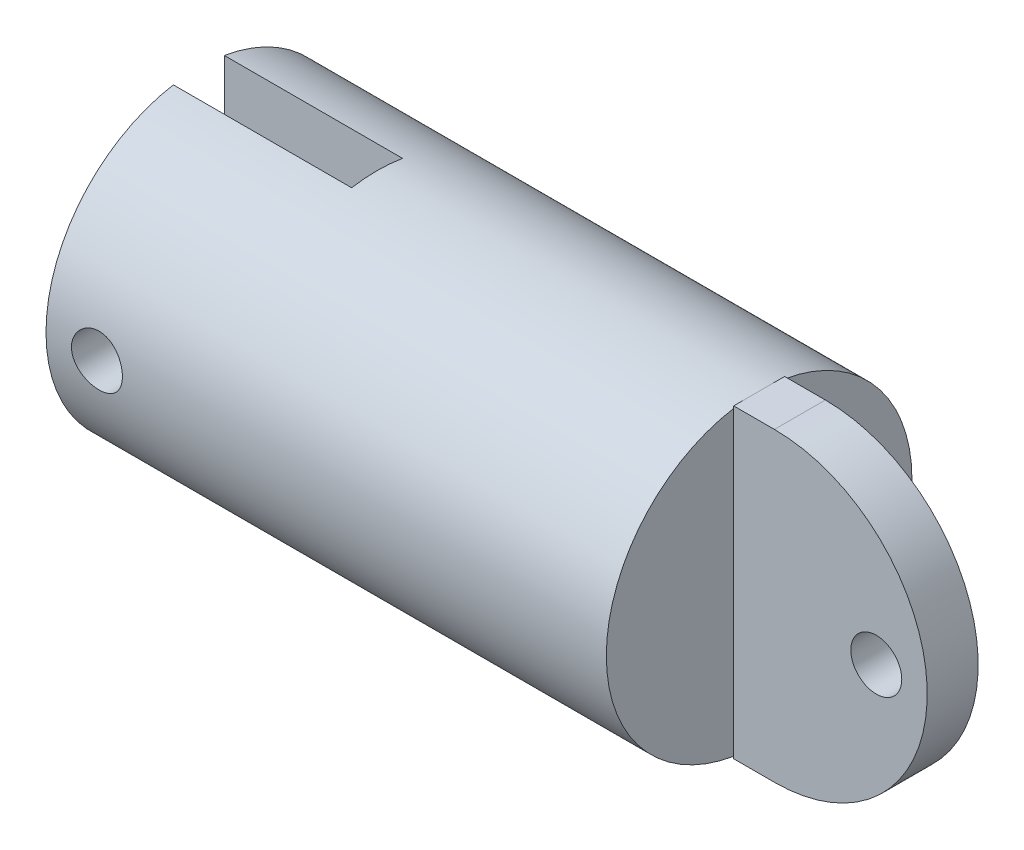
ISO-10303-21;
HEADER;
FILE_DESCRIPTION(('STEP AP214'),'2;1');
FILE_NAME('part.step','',(''),(''),'','','');
FILE_SCHEMA(('AUTOMOTIVE_DESIGN { 1 0 10303 214 1 1 1 1 }'));
ENDSEC;
DATA;
#1=APPLICATION_CONTEXT('core data for automotive mechanical design processes');
#2=APPLICATION_PROTOCOL_DEFINITION('international standard','automotive_design',2000,#1);
#3=PRODUCT_CONTEXT('',#1,'mechanical');
#4=PRODUCT('Part','Part','',(#3));
#5=PRODUCT_RELATED_PRODUCT_CATEGORY('part','',(#4));
#6=PRODUCT_DEFINITION_FORMATION('','',#4);
#7=PRODUCT_DEFINITION_CONTEXT('part definition',#1,'design');
#8=PRODUCT_DEFINITION('design','',#6,#7);
#9=PRODUCT_DEFINITION_SHAPE('','',#8);
#10=(LENGTH_UNIT() NAMED_UNIT(*) SI_UNIT(.MILLI.,.METRE.));
#11=(NAMED_UNIT(*) PLANE_ANGLE_UNIT() SI_UNIT($,.RADIAN.));
#12=(NAMED_UNIT(*) SI_UNIT($,.STERADIAN.) SOLID_ANGLE_UNIT());
#13=UNCERTAINTY_MEASURE_WITH_UNIT(LENGTH_MEASURE(1.E-05),#10,'distance_accuracy_value','');
#14=(GEOMETRIC_REPRESENTATION_CONTEXT(3) GLOBAL_UNCERTAINTY_ASSIGNED_CONTEXT((#13)) GLOBAL_UNIT_ASSIGNED_CONTEXT((#10,
#11,#12)) REPRESENTATION_CONTEXT('',''));
#15=CARTESIAN_POINT('',(0.,0.,0.));
#16=DIRECTION('',(0.,0.,1.));
#17=DIRECTION('',(1.,0.,0.));
#18=AXIS2_PLACEMENT_3D('',#15,#16,#17);
#19=CARTESIAN_POINT('',(0.,0.,0.));
#20=DIRECTION('',(1.,0.,0.));
#21=DIRECTION('',(0.,0.,-1.));
#22=AXIS2_PLACEMENT_3D('',#19,#20,#21);
#23=PLANE('',#22);
#24=DIRECTION('',(0.,1.,0.));
#25=VECTOR('',#24,1.);
#26=CARTESIAN_POINT('',(0.,15.,-2.5));
#27=LINE('',#26,#25);
#28=CARTESIAN_POINT('',(0.,-14.790199457749,-2.5));
#29=VERTEX_POINT('',#28);
#30=CARTESIAN_POINT('',(0.,14.790199457749,-2.5));
#31=VERTEX_POINT('',#30);
#32=EDGE_CURVE('E11',#29,#31,#27,.T.);
#33=ORIENTED_EDGE('',*,*,#32,.F.);
#34=CARTESIAN_POINT('',(0.,0.,0.));
#35=DIRECTION('',(1.,0.,0.));
#36=DIRECTION('',(0.,0.,-1.));
#37=AXIS2_PLACEMENT_3D('',#34,#35,#36);
#38=CIRCLE('',#37,15.);
#39=EDGE_CURVE('E272',#29,#31,#38,.T.);
#40=ORIENTED_EDGE('',*,*,#39,.T.);
#41=EDGE_LOOP('',(#33,#40));
#42=FACE_BOUND('',#41,.T.);
#43=ADVANCED_FACE('F39',(#42),#23,.T.);
#44=CARTESIAN_POINT('',(-55.,0.,0.));
#45=DIRECTION('',(1.,0.,0.));
#46=DIRECTION('',(0.,0.,-1.));
#47=AXIS2_PLACEMENT_3D('',#44,#45,#46);
#48=PLANE('',#47);
#49=CARTESIAN_POINT('',(-55.,0.,0.));
#50=DIRECTION('',(1.,0.,0.));
#51=DIRECTION('',(0.,0.,-1.));
#52=AXIS2_PLACEMENT_3D('',#49,#50,#51);
#53=CIRCLE('',#52,15.);
#54=CARTESIAN_POINT('',(-55.,-14.790199457749,-2.5));
#55=VERTEX_POINT('',#54);
#56=CARTESIAN_POINT('',(-55.,14.790199457749,-2.5));
#57=VERTEX_POINT('',#56);
#58=EDGE_CURVE('E256',#55,#57,#53,.T.);
#59=ORIENTED_EDGE('',*,*,#58,.F.);
#60=DIRECTION('',(0.,1.,0.));
#61=VECTOR('',#60,1.);
#62=CARTESIAN_POINT('',(-55.,0.,-2.5));
#63=LINE('',#62,#61);
#64=EDGE_CURVE('E257',#55,#57,#63,.T.);
#65=ORIENTED_EDGE('',*,*,#64,.T.);
#66=EDGE_LOOP('',(#59,#65));
#67=FACE_BOUND('',#66,.T.);
#68=ADVANCED_FACE('F236',(#67),#48,.F.);
#69=CARTESIAN_POINT('',(-55.,0.,0.));
#70=DIRECTION('',(1.,0.,0.));
#71=DIRECTION('',(0.,0.,-1.));
#72=AXIS2_PLACEMENT_3D('',#69,#70,#71);
#73=CYLINDRICAL_SURFACE('',#72,15.);
#74=CARTESIAN_POINT('',(-47.5,0.,-15.));
#75=CARTESIAN_POINT('',(-47.5000055889478,-0.139390904958215,-14.9999976116882));
#76=CARTESIAN_POINT('',(-47.5116972749689,-0.278857881838821,-14.9980367791303));
#77=CARTESIAN_POINT('',(-47.5581356587653,-0.553880221673043,-14.9904034494139));
#78=CARTESIAN_POINT('',(-47.5929035569116,-0.689431867959247,-14.9847275392389));
#79=CARTESIAN_POINT('',(-47.6844154485928,-0.952604747212645,-14.9703006823645));
#80=CARTESIAN_POINT('',(-47.7411414656406,-1.0802323684319,-14.9615522515919));
#81=CARTESIAN_POINT('',(-47.8749122920524,-1.32414184197795,-14.9419422708207));
#82=CARTESIAN_POINT('',(-47.951954777483,-1.44042498987859,-14.9310809625443));
#83=CARTESIAN_POINT('',(-48.1249550838205,-1.65947261429168,-14.9083331745831));
#84=CARTESIAN_POINT('',(-48.2210691146361,-1.76211290353497,-14.8964387181486));
#85=CARTESIAN_POINT('',(-48.4291479684728,-1.94988849865993,-14.8730262687673));
#86=CARTESIAN_POINT('',(-48.5411137914566,-2.03502269939097,-14.8615082996267));
#87=CARTESIAN_POINT('',(-48.7785709661971,-2.18586712560514,-14.8400756575978));
#88=CARTESIAN_POINT('',(-48.9041413368048,-2.25145455286101,-14.8301712909164));
#89=CARTESIAN_POINT('',(-49.1647095643006,-2.36055836541122,-14.8131978979467));
#90=CARTESIAN_POINT('',(-49.2997067836776,-2.40407624156562,-14.8061286801431));
#91=CARTESIAN_POINT('',(-49.5739802748565,-2.46741437778481,-14.7957053684276));
#92=CARTESIAN_POINT('',(-49.7132057365014,-2.4874490291354,-14.792317684857));
#93=CARTESIAN_POINT('',(-49.9930802768835,-2.50391672528988,-14.7895393893665));
#94=CARTESIAN_POINT('',(-50.1337292541673,-2.500351440389,-14.7901484945721));
#95=CARTESIAN_POINT('',(-50.4109278612755,-2.46989509839615,-14.7952642886356));
#96=CARTESIAN_POINT('',(-50.5475048035452,-2.44324488188977,-14.7997307331892));
#97=CARTESIAN_POINT('',(-50.8142213178291,-2.36775314040345,-14.8119949521101));
#98=CARTESIAN_POINT('',(-50.9443606688886,-2.31891085431974,-14.8197928407327));
#99=CARTESIAN_POINT('',(-51.1952288234409,-2.20017724609391,-14.837884793341));
#100=CARTESIAN_POINT('',(-51.3159094060812,-2.13018591387971,-14.8481906710733));
#101=CARTESIAN_POINT('',(-51.5439044005384,-1.97121201755743,-14.8701291841501));
#102=CARTESIAN_POINT('',(-51.6512177324549,-1.88222792065429,-14.8817619265429));
#103=CARTESIAN_POINT('',(-51.8508260858073,-1.68648221215906,-14.9052202787979));
#104=CARTESIAN_POINT('',(-51.9429185185401,-1.57951396387313,-14.9170464923165));
#105=CARTESIAN_POINT('',(-52.1078777626654,-1.35153524898165,-14.9394260139672));
#106=CARTESIAN_POINT('',(-52.1807444501832,-1.23052469190642,-14.9499793138975));
#107=CARTESIAN_POINT('',(-52.3052022271363,-0.97770591616671,-14.9686389289291));
#108=CARTESIAN_POINT('',(-52.3567754193313,-0.84588872556466,-14.9767431840745));
#109=CARTESIAN_POINT('',(-52.436994215246,-0.575298345602731,-14.9895750301266));
#110=CARTESIAN_POINT('',(-52.4656417369737,-0.436525739179469,-14.9943029035047));
#111=CARTESIAN_POINT('',(-52.4989213584611,-0.157709901301626,-14.9998112984269));
#112=CARTESIAN_POINT('',(-52.5038315718056,-0.017700737151014,-15.0006375301278));
#113=CARTESIAN_POINT('',(-52.4902386555719,0.261139772889886,-14.9983747442117));
#114=CARTESIAN_POINT('',(-52.4717364268663,0.399971163892037,-14.9952858772412));
#115=CARTESIAN_POINT('',(-52.4120751506645,0.671656175546762,-14.985568269382));
#116=CARTESIAN_POINT('',(-52.3710537916099,0.804540868385376,-14.9789610480131));
#117=CARTESIAN_POINT('',(-52.2676654818005,1.06154688486044,-14.9629446445536));
#118=CARTESIAN_POINT('',(-52.2052973323647,1.18566771590972,-14.9535353051202));
#119=CARTESIAN_POINT('',(-52.0603488753032,1.42283068946896,-14.9328451630241));
#120=CARTESIAN_POINT('',(-51.9775948438328,1.53576525093715,-14.9215485588702));
#121=CARTESIAN_POINT('',(-51.7944626846149,1.74624358550269,-14.898384673919));
#122=CARTESIAN_POINT('',(-51.6940832767233,1.84378623969658,-14.8865173517155));
#123=CARTESIAN_POINT('',(-51.4773024519286,2.021742779658,-14.8634017523585));
#124=CARTESIAN_POINT('',(-51.3607458344856,2.10196876111371,-14.8521611613711));
#125=CARTESIAN_POINT('',(-51.1156470308615,2.24170231029499,-14.8317152977788));
#126=CARTESIAN_POINT('',(-50.9871052247725,2.30121053476982,-14.8225099606602));
#127=CARTESIAN_POINT('',(-50.7222102671879,2.39753833147315,-14.807234536977));
#128=CARTESIAN_POINT('',(-50.5858919049695,2.43445143254795,-14.8011515431106));
#129=CARTESIAN_POINT('',(-50.3088798707782,2.48483545377828,-14.7927771683526));
#130=CARTESIAN_POINT('',(-50.1681865802679,2.49830841194617,-14.7904854578272));
#131=CARTESIAN_POINT('',(-49.8882948340376,2.50137286604736,-14.7899673308401));
#132=CARTESIAN_POINT('',(-49.7490996214247,2.49126013612519,-14.7916905650565));
#133=CARTESIAN_POINT('',(-49.4744207519492,2.44807983895685,-14.7988978145373));
#134=CARTESIAN_POINT('',(-49.3389370830581,2.41501234611248,-14.8043818176121));
#135=CARTESIAN_POINT('',(-49.0756415627074,2.3269744895949,-14.8184735628172));
#136=CARTESIAN_POINT('',(-48.947820989944,2.27202959060044,-14.8270776721967));
#137=CARTESIAN_POINT('',(-48.7031643308051,2.14182700391591,-14.8464436892221));
#138=CARTESIAN_POINT('',(-48.5863287896279,2.06656830874856,-14.857205703884));
#139=CARTESIAN_POINT('',(-48.3654644168922,1.89681888437215,-14.8798345404562));
#140=CARTESIAN_POINT('',(-48.2616039832997,1.80211056359365,-14.891712955763));
#141=CARTESIAN_POINT('',(-48.0711483955251,1.59660903138023,-14.9151437236084));
#142=CARTESIAN_POINT('',(-47.9845572313618,1.48581211291264,-14.9266960002655));
#143=CARTESIAN_POINT('',(-47.8305517318001,1.25036916964028,-14.9482652964222));
#144=CARTESIAN_POINT('',(-47.7632739606871,1.12563278753282,-14.958271162531));
#145=CARTESIAN_POINT('',(-47.6507305153901,0.866513069378982,-14.9755116760178));
#146=CARTESIAN_POINT('',(-47.6054429189203,0.73213949483001,-14.9827490817748));
#147=CARTESIAN_POINT('',(-47.5479947258733,0.4977033100454,-14.9920579083296));
#148=CARTESIAN_POINT('',(-47.530025530384,0.399058830298447,-14.9950202727336));
#149=CARTESIAN_POINT('',(-47.5060262621552,0.200289310319809,-14.9989921598612));
#150=CARTESIAN_POINT('',(-47.4999959838626,0.100164295608494,-15.0000017162064));
#151=CARTESIAN_POINT('',(-47.5,0.,-15.));
#152=B_SPLINE_CURVE_WITH_KNOTS('',3,(#74,#75,#76,#77,#78,#79,#80,#81,#82,#83,#84,#85,#86,#87,
#88,#89,#90,#91,#92,#93,#94,#95,#96,#97,#98,#99,#100,#101,#102,#103,#104,#105,#106,#107,#108,
#109,#110,#111,#112,#113,#114,#115,#116,#117,#118,#119,#120,#121,#122,#123,#124,#125,#126,#127,
#128,#129,#130,#131,#132,#133,#134,#135,#136,#137,#138,#139,#140,#141,#142,#143,#144,#145,#146,
#147,#148,#149,#150,#151),.UNSPECIFIED.,.T.,.F.,(4,2,2,2,2,2,2,2,2,2,2,2,2,2,2,2,2,2,2,2,2,2,2,
2,2,2,2,2,2,2,2,2,2,2,2,2,2,2,4),(0.,0.41780658493851,0.835997545695421,1.25384686702527,
1.67164841267479,2.09302491062332,2.51442800169857,2.93842520823841,3.36239376876182,
3.78246077103424,4.20249804320887,4.61820521760409,5.03392665025382,5.45164556632558,
5.86939820680574,6.29232769911327,6.71525991635848,7.13854688915904,7.56179844521149,
7.98007883491398,8.3983431303586,8.81407807006416,9.22983635826067,9.64926825627025,
10.0687306305428,10.4925382200762,10.9163323737594,11.3383602234177,11.7603513778662,
12.177079095227,12.5938054618813,13.0100481822623,13.4263115502934,13.8475138419339,
14.2688133387897,14.693022316072,15.1168075213007,15.4170424816402,15.7172722727697),.UNSPECIFIED.);
#153=CARTESIAN_POINT('',(-47.5,0.,-15.));
#154=VERTEX_POINT('',#153);
#155=EDGE_CURVE('E204',#154,#154,#152,.T.);
#156=ORIENTED_EDGE('',*,*,#155,.F.);
#157=EDGE_LOOP('',(#156));
#158=FACE_BOUND('',#157,.T.);
#159=CARTESIAN_POINT('',(-47.5,0.,15.));
#160=CARTESIAN_POINT('',(-47.5000055889478,0.139390904958215,14.9999976116882));
#161=CARTESIAN_POINT('',(-47.5116972749689,0.278857881838821,14.9980367791303));
#162=CARTESIAN_POINT('',(-47.5581356587653,0.553880221673043,14.9904034494139));
#163=CARTESIAN_POINT('',(-47.5929035569116,0.689431867959247,14.9847275392389));
#164=CARTESIAN_POINT('',(-47.6844154485928,0.952604747212645,14.9703006823645));
#165=CARTESIAN_POINT('',(-47.7411414656406,1.0802323684319,14.9615522515919));
#166=CARTESIAN_POINT('',(-47.8749122920524,1.32414184197795,14.9419422708207));
#167=CARTESIAN_POINT('',(-47.951954777483,1.44042498987859,14.9310809625443));
#168=CARTESIAN_POINT('',(-48.1249550838205,1.65947261429168,14.9083331745831));
#169=CARTESIAN_POINT('',(-48.2210691146361,1.76211290353497,14.8964387181486));
#170=CARTESIAN_POINT('',(-48.4291479684728,1.94988849865993,14.8730262687673));
#171=CARTESIAN_POINT('',(-48.5411137914566,2.03502269939097,14.8615082996267));
#172=CARTESIAN_POINT('',(-48.7785709661971,2.18586712560514,14.8400756575978));
#173=CARTESIAN_POINT('',(-48.9041413368048,2.25145455286101,14.8301712909164));
#174=CARTESIAN_POINT('',(-49.1647095643006,2.36055836541122,14.8131978979467));
#175=CARTESIAN_POINT('',(-49.2997067836776,2.40407624156562,14.8061286801431));
#176=CARTESIAN_POINT('',(-49.5739802748565,2.46741437778481,14.7957053684276));
#177=CARTESIAN_POINT('',(-49.7132057365014,2.4874490291354,14.792317684857));
#178=CARTESIAN_POINT('',(-49.9930802768835,2.50391672528988,14.7895393893665));
#179=CARTESIAN_POINT('',(-50.1337292541673,2.500351440389,14.7901484945721));
#180=CARTESIAN_POINT('',(-50.4109278612755,2.46989509839615,14.7952642886356));
#181=CARTESIAN_POINT('',(-50.5475048035452,2.44324488188977,14.7997307331892));
#182=CARTESIAN_POINT('',(-50.8142213178291,2.36775314040345,14.8119949521101));
#183=CARTESIAN_POINT('',(-50.9443606688886,2.31891085431974,14.8197928407327));
#184=CARTESIAN_POINT('',(-51.1952288234409,2.20017724609391,14.837884793341));
#185=CARTESIAN_POINT('',(-51.3159094060812,2.13018591387971,14.8481906710733));
#186=CARTESIAN_POINT('',(-51.5439044005384,1.97121201755743,14.8701291841501));
#187=CARTESIAN_POINT('',(-51.6512177324549,1.88222792065429,14.8817619265429));
#188=CARTESIAN_POINT('',(-51.8508260858073,1.68648221215906,14.9052202787979));
#189=CARTESIAN_POINT('',(-51.9429185185401,1.57951396387313,14.9170464923165));
#190=CARTESIAN_POINT('',(-52.1078777626654,1.35153524898165,14.9394260139672));
#191=CARTESIAN_POINT('',(-52.1807444501832,1.23052469190642,14.9499793138975));
#192=CARTESIAN_POINT('',(-52.3052022271363,0.97770591616671,14.9686389289291));
#193=CARTESIAN_POINT('',(-52.3567754193313,0.84588872556466,14.9767431840745));
#194=CARTESIAN_POINT('',(-52.436994215246,0.575298345602731,14.9895750301266));
#195=CARTESIAN_POINT('',(-52.4656417369737,0.436525739179469,14.9943029035047));
#196=CARTESIAN_POINT('',(-52.4989213584611,0.157709901301626,14.9998112984269));
#197=CARTESIAN_POINT('',(-52.5038315718056,0.017700737151014,15.0006375301278));
#198=CARTESIAN_POINT('',(-52.4902386555719,-0.261139772889886,14.9983747442117));
#199=CARTESIAN_POINT('',(-52.4717364268663,-0.399971163892037,14.9952858772412));
#200=CARTESIAN_POINT('',(-52.4120751506645,-0.671656175546762,14.985568269382));
#201=CARTESIAN_POINT('',(-52.3710537916099,-0.804540868385376,14.9789610480131));
#202=CARTESIAN_POINT('',(-52.2676654818005,-1.06154688486044,14.9629446445536));
#203=CARTESIAN_POINT('',(-52.2052973323647,-1.18566771590972,14.9535353051202));
#204=CARTESIAN_POINT('',(-52.0603488753032,-1.42283068946896,14.9328451630241));
#205=CARTESIAN_POINT('',(-51.9775948438328,-1.53576525093715,14.9215485588702));
#206=CARTESIAN_POINT('',(-51.7944626846149,-1.74624358550269,14.898384673919));
#207=CARTESIAN_POINT('',(-51.6940832767233,-1.84378623969658,14.8865173517155));
#208=CARTESIAN_POINT('',(-51.4773024519286,-2.021742779658,14.8634017523585));
#209=CARTESIAN_POINT('',(-51.3607458344856,-2.10196876111371,14.8521611613711));
#210=CARTESIAN_POINT('',(-51.1156470308615,-2.24170231029499,14.8317152977788));
#211=CARTESIAN_POINT('',(-50.9871052247725,-2.30121053476982,14.8225099606602));
#212=CARTESIAN_POINT('',(-50.7222102671879,-2.39753833147315,14.807234536977));
#213=CARTESIAN_POINT('',(-50.5858919049695,-2.43445143254795,14.8011515431106));
#214=CARTESIAN_POINT('',(-50.3088798707782,-2.48483545377828,14.7927771683526));
#215=CARTESIAN_POINT('',(-50.1681865802679,-2.49830841194617,14.7904854578272));
#216=CARTESIAN_POINT('',(-49.8882948340376,-2.50137286604736,14.7899673308401));
#217=CARTESIAN_POINT('',(-49.7490996214247,-2.49126013612519,14.7916905650565));
#218=CARTESIAN_POINT('',(-49.4744207519492,-2.44807983895685,14.7988978145373));
#219=CARTESIAN_POINT('',(-49.3389370830581,-2.41501234611248,14.8043818176121));
#220=CARTESIAN_POINT('',(-49.0756415627074,-2.3269744895949,14.8184735628172));
#221=CARTESIAN_POINT('',(-48.947820989944,-2.27202959060044,14.8270776721967));
#222=CARTESIAN_POINT('',(-48.7031643308051,-2.14182700391591,14.8464436892221));
#223=CARTESIAN_POINT('',(-48.5863287896279,-2.06656830874856,14.857205703884));
#224=CARTESIAN_POINT('',(-48.3654644168922,-1.89681888437215,14.8798345404562));
#225=CARTESIAN_POINT('',(-48.2616039832997,-1.80211056359365,14.891712955763));
#226=CARTESIAN_POINT('',(-48.0711483955251,-1.59660903138023,14.9151437236084));
#227=CARTESIAN_POINT('',(-47.9845572313618,-1.48581211291264,14.9266960002655));
#228=CARTESIAN_POINT('',(-47.8305517318001,-1.25036916964028,14.9482652964222));
#229=CARTESIAN_POINT('',(-47.7632739606871,-1.12563278753282,14.958271162531));
#230=CARTESIAN_POINT('',(-47.6507305153901,-0.866513069378982,14.9755116760178));
#231=CARTESIAN_POINT('',(-47.6054429189203,-0.73213949483001,14.9827490817748));
#232=CARTESIAN_POINT('',(-47.5479947258733,-0.4977033100454,14.9920579083296));
#233=CARTESIAN_POINT('',(-47.530025530384,-0.399058830298447,14.9950202727336));
#234=CARTESIAN_POINT('',(-47.5060262621552,-0.200289310319809,14.9989921598612));
#235=CARTESIAN_POINT('',(-47.4999959838626,-0.100164295608494,15.0000017162064));
#236=CARTESIAN_POINT('',(-47.5,0.,15.));
#237=B_SPLINE_CURVE_WITH_KNOTS('',3,(#159,#160,#161,#162,#163,#164,#165,#166,#167,#168,#169,
#170,#171,#172,#173,#174,#175,#176,#177,#178,#179,#180,#181,#182,#183,#184,#185,#186,#187,#188,
#189,#190,#191,#192,#193,#194,#195,#196,#197,#198,#199,#200,#201,#202,#203,#204,#205,#206,#207,
#208,#209,#210,#211,#212,#213,#214,#215,#216,#217,#218,#219,#220,#221,#222,#223,#224,#225,#226,
#227,#228,#229,#230,#231,#232,#233,#234,#235,#236),.UNSPECIFIED.,.T.,.F.,(4,2,2,2,2,2,2,2,2,2,2,
2,2,2,2,2,2,2,2,2,2,2,2,2,2,2,2,2,2,2,2,2,2,2,2,2,2,2,4),(0.,0.41780658493851,0.835997545695421,
1.25384686702527,1.67164841267479,2.09302491062332,2.51442800169857,2.93842520823841,
3.36239376876182,3.78246077103424,4.20249804320887,4.61820521760409,5.03392665025382,
5.45164556632558,5.86939820680574,6.29232769911327,6.71525991635848,7.13854688915904,
7.56179844521149,7.98007883491398,8.3983431303586,8.81407807006416,9.22983635826067,
9.64926825627025,10.0687306305428,10.4925382200762,10.9163323737594,11.3383602234177,
11.7603513778662,12.177079095227,12.5938054618813,13.0100481822623,13.4263115502934,
13.8475138419339,14.2688133387897,14.693022316072,15.1168075213007,15.4170424816402,
15.7172722727697),.UNSPECIFIED.);
#238=CARTESIAN_POINT('',(-47.5,0.,15.));
#239=VERTEX_POINT('',#238);
#240=EDGE_CURVE('E196',#239,#239,#237,.T.);
#241=ORIENTED_EDGE('',*,*,#240,.F.);
#242=EDGE_LOOP('',(#241));
#243=FACE_BOUND('',#242,.T.);
#244=DIRECTION('',(1.,0.,0.));
#245=VECTOR('',#244,1.);
#246=CARTESIAN_POINT('',(-55.,-14.790199457749,-2.5));
#247=LINE('',#246,#245);
#248=CARTESIAN_POINT('',(-37.5,-14.790199457749,-2.5));
#249=VERTEX_POINT('',#248);
#250=EDGE_CURVE('E297',#55,#249,#247,.T.);
#251=ORIENTED_EDGE('',*,*,#250,.F.);
#252=ORIENTED_EDGE('',*,*,#58,.T.);
#253=DIRECTION('',(1.,0.,0.));
#254=VECTOR('',#253,1.);
#255=CARTESIAN_POINT('',(-55.,14.790199457749,-2.5));
#256=LINE('',#255,#254);
#257=CARTESIAN_POINT('',(-37.5,14.790199457749,-2.5));
#258=VERTEX_POINT('',#257);
#259=EDGE_CURVE('E274',#258,#57,#256,.F.);
#260=ORIENTED_EDGE('',*,*,#259,.F.);
#261=CARTESIAN_POINT('',(-37.5,0.,0.));
#262=DIRECTION('',(1.,0.,0.));
#263=DIRECTION('',(0.,0.,-1.));
#264=AXIS2_PLACEMENT_3D('',#261,#262,#263);
#265=CIRCLE('',#264,15.);
#266=CARTESIAN_POINT('',(-37.5,14.790199457749,2.5));
#267=VERTEX_POINT('',#266);
#268=EDGE_CURVE('E282',#267,#258,#265,.F.);
#269=ORIENTED_EDGE('',*,*,#268,.F.);
#270=DIRECTION('',(1.,0.,0.));
#271=VECTOR('',#270,1.);
#272=CARTESIAN_POINT('',(-55.,14.790199457749,2.5));
#273=LINE('',#272,#271);
#274=CARTESIAN_POINT('',(-55.,14.790199457749,2.5));
#275=VERTEX_POINT('',#274);
#276=EDGE_CURVE('E324',#275,#267,#273,.T.);
#277=ORIENTED_EDGE('',*,*,#276,.F.);
#278=CARTESIAN_POINT('',(-55.,-14.790199457749,2.5));
#279=VERTEX_POINT('',#278);
#280=EDGE_CURVE('E262',#275,#279,#53,.T.);
#281=ORIENTED_EDGE('',*,*,#280,.T.);
#282=DIRECTION('',(1.,0.,0.));
#283=VECTOR('',#282,1.);
#284=CARTESIAN_POINT('',(-55.,-14.790199457749,2.5));
#285=LINE('',#284,#283);
#286=CARTESIAN_POINT('',(-37.5,-14.790199457749,2.5));
#287=VERTEX_POINT('',#286);
#288=EDGE_CURVE('E321',#287,#279,#285,.F.);
#289=ORIENTED_EDGE('',*,*,#288,.F.);
#290=EDGE_CURVE('E284',#249,#287,#265,.F.);
#291=ORIENTED_EDGE('',*,*,#290,.F.);
#292=EDGE_LOOP('',(#251,#252,#260,#269,#277,#281,#289,#291));
#293=FACE_BOUND('',#292,.T.);
#294=CARTESIAN_POINT('',(0.,15.,0.));
#295=VERTEX_POINT('',#294);
#296=EDGE_CURVE('E263',#31,#295,#38,.T.);
#297=ORIENTED_EDGE('',*,*,#296,.F.);
#298=ORIENTED_EDGE('',*,*,#39,.F.);
#299=CARTESIAN_POINT('',(0.,-15.,0.));
#300=VERTEX_POINT('',#299);
#301=EDGE_CURVE('E64',#300,#29,#38,.T.);
#302=ORIENTED_EDGE('',*,*,#301,.F.);
#303=CARTESIAN_POINT('',(0.,-14.790199457749,2.5));
#304=VERTEX_POINT('',#303);
#305=EDGE_CURVE('E313',#304,#300,#38,.T.);
#306=ORIENTED_EDGE('',*,*,#305,.F.);
#307=CARTESIAN_POINT('',(0.,14.790199457749,2.5));
#308=VERTEX_POINT('',#307);
#309=EDGE_CURVE('E316',#308,#304,#38,.T.);
#310=ORIENTED_EDGE('',*,*,#309,.F.);
#311=EDGE_CURVE('E270',#295,#308,#38,.T.);
#312=ORIENTED_EDGE('',*,*,#311,.F.);
#313=EDGE_LOOP('',(#297,#298,#302,#306,#310,#312));
#314=FACE_BOUND('',#313,.T.);
#315=ADVANCED_FACE('F41',(#158,#243,#293,#314),#73,.T.);
#316=ORIENTED_EDGE('',*,*,#280,.F.);
#317=DIRECTION('',(0.,-1.,0.));
#318=VECTOR('',#317,1.);
#319=CARTESIAN_POINT('',(-55.,0.,2.5));
#320=LINE('',#319,#318);
#321=EDGE_CURVE('E268',#275,#279,#320,.T.);
#322=ORIENTED_EDGE('',*,*,#321,.T.);
#323=EDGE_LOOP('',(#316,#322));
#324=FACE_BOUND('',#323,.T.);
#325=ADVANCED_FACE('F233',(#324),#48,.F.);
#326=DIRECTION('',(0.,-1.,0.));
#327=VECTOR('',#326,1.);
#328=CARTESIAN_POINT('',(0.,15.,2.5));
#329=LINE('',#328,#327);
#330=EDGE_CURVE('E50',#308,#304,#329,.T.);
#331=ORIENTED_EDGE('',*,*,#330,.F.);
#332=ORIENTED_EDGE('',*,*,#309,.T.);
#333=EDGE_LOOP('',(#331,#332));
#334=FACE_BOUND('',#333,.T.);
#335=ADVANCED_FACE('F224',(#334),#23,.T.);
#336=CARTESIAN_POINT('',(-55.,-15.,-2.5));
#337=DIRECTION('',(0.,0.,-1.));
#338=DIRECTION('',(-1.,0.,0.));
#339=AXIS2_PLACEMENT_3D('',#336,#337,#338);
#340=PLANE('',#339);
#341=CARTESIAN_POINT('',(-50.,0.,-2.5));
#342=DIRECTION('',(0.,0.,-1.));
#343=DIRECTION('',(-1.,0.,0.));
#344=AXIS2_PLACEMENT_3D('',#341,#342,#343);
#345=CIRCLE('',#344,2.5);
#346=CARTESIAN_POINT('',(-52.5,0.,-2.5));
#347=VERTEX_POINT('',#346);
#348=EDGE_CURVE('E192',#347,#347,#345,.T.);
#349=ORIENTED_EDGE('',*,*,#348,.T.);
#350=EDGE_LOOP('',(#349));
#351=FACE_BOUND('',#350,.T.);
#352=ORIENTED_EDGE('',*,*,#259,.T.);
#353=ORIENTED_EDGE('',*,*,#64,.F.);
#354=ORIENTED_EDGE('',*,*,#250,.T.);
#355=DIRECTION('',(0.,1.,0.));
#356=VECTOR('',#355,1.);
#357=CARTESIAN_POINT('',(-37.5,-15.,-2.5));
#358=LINE('',#357,#356);
#359=EDGE_CURVE('E330',#249,#258,#358,.T.);
#360=ORIENTED_EDGE('',*,*,#359,.T.);
#361=EDGE_LOOP('',(#352,#353,#354,#360));
#362=FACE_BOUND('',#361,.T.);
#363=ADVANCED_FACE('F219',(#351,#362),#340,.F.);
#364=CARTESIAN_POINT('',(-37.5,-15.,-2.5));
#365=DIRECTION('',(1.,0.,0.));
#366=DIRECTION('',(0.,0.,-1.));
#367=AXIS2_PLACEMENT_3D('',#364,#365,#366);
#368=PLANE('',#367);
#369=ORIENTED_EDGE('',*,*,#359,.F.);
#370=ORIENTED_EDGE('',*,*,#290,.T.);
#371=DIRECTION('',(0.,1.,0.));
#372=VECTOR('',#371,1.);
#373=CARTESIAN_POINT('',(-37.5,-15.,2.5));
#374=LINE('',#373,#372);
#375=EDGE_CURVE('E331',#287,#267,#374,.T.);
#376=ORIENTED_EDGE('',*,*,#375,.T.);
#377=ORIENTED_EDGE('',*,*,#268,.T.);
#378=EDGE_LOOP('',(#369,#370,#376,#377));
#379=FACE_BOUND('',#378,.T.);
#380=ADVANCED_FACE('F223',(#379),#368,.F.);
#381=CARTESIAN_POINT('',(-55.,-15.,2.5));
#382=DIRECTION('',(0.,0.,1.));
#383=DIRECTION('',(1.,0.,0.));
#384=AXIS2_PLACEMENT_3D('',#381,#382,#383);
#385=PLANE('',#384);
#386=CARTESIAN_POINT('',(-50.,0.,2.5));
#387=DIRECTION('',(0.,0.,1.));
#388=DIRECTION('',(1.,0.,0.));
#389=AXIS2_PLACEMENT_3D('',#386,#387,#388);
#390=CIRCLE('',#389,2.5);
#391=CARTESIAN_POINT('',(-47.5,0.,2.5));
#392=VERTEX_POINT('',#391);
#393=EDGE_CURVE('E191',#392,#392,#390,.T.);
#394=ORIENTED_EDGE('',*,*,#393,.T.);
#395=EDGE_LOOP('',(#394));
#396=FACE_BOUND('',#395,.T.);
#397=ORIENTED_EDGE('',*,*,#288,.T.);
#398=ORIENTED_EDGE('',*,*,#321,.F.);
#399=ORIENTED_EDGE('',*,*,#276,.T.);
#400=ORIENTED_EDGE('',*,*,#375,.F.);
#401=EDGE_LOOP('',(#397,#398,#399,#400));
#402=FACE_BOUND('',#401,.T.);
#403=ADVANCED_FACE('F228',(#396,#402),#385,.F.);
#404=CARTESIAN_POINT('',(-50.,0.,-15.));
#405=DIRECTION('',(0.,0.,1.));
#406=DIRECTION('',(1.,0.,0.));
#407=AXIS2_PLACEMENT_3D('',#404,#405,#406);
#408=CYLINDRICAL_SURFACE('',#407,2.5);
#409=ORIENTED_EDGE('',*,*,#240,.T.);
#410=EDGE_LOOP('',(#409));
#411=FACE_BOUND('',#410,.T.);
#412=ORIENTED_EDGE('',*,*,#393,.F.);
#413=EDGE_LOOP('',(#412));
#414=FACE_BOUND('',#413,.T.);
#415=ADVANCED_FACE('F215',(#411,#414),#408,.F.);
#416=ORIENTED_EDGE('',*,*,#155,.T.);
#417=EDGE_LOOP('',(#416));
#418=FACE_BOUND('',#417,.T.);
#419=ORIENTED_EDGE('',*,*,#348,.F.);
#420=EDGE_LOOP('',(#419));
#421=FACE_BOUND('',#420,.T.);
#422=ADVANCED_FACE('F209',(#418,#421),#408,.F.);
#423=CARTESIAN_POINT('',(0.,0.,0.));
#424=DIRECTION('',(-1.,0.,0.));
#425=DIRECTION('',(0.,0.,1.));
#426=AXIS2_PLACEMENT_3D('',#423,#424,#425);
#427=PLANE('',#426);
#428=CARTESIAN_POINT('',(0.,15.,-2.5));
#429=VERTEX_POINT('',#428);
#430=EDGE_CURVE('E53',#31,#429,#27,.T.);
#431=ORIENTED_EDGE('',*,*,#430,.F.);
#432=ORIENTED_EDGE('',*,*,#296,.T.);
#433=DIRECTION('',(0.,0.,1.));
#434=VECTOR('',#433,1.);
#435=CARTESIAN_POINT('',(0.,15.,2.5));
#436=LINE('',#435,#434);
#437=EDGE_CURVE('E171',#429,#295,#436,.T.);
#438=ORIENTED_EDGE('',*,*,#437,.F.);
#439=EDGE_LOOP('',(#431,#432,#438));
#440=FACE_BOUND('',#439,.T.);
#441=ADVANCED_FACE('F214',(#440),#427,.T.);
#442=CARTESIAN_POINT('',(0.,15.,2.5));
#443=VERTEX_POINT('',#442);
#444=EDGE_CURVE('E164',#295,#443,#436,.T.);
#445=ORIENTED_EDGE('',*,*,#444,.F.);
#446=ORIENTED_EDGE('',*,*,#311,.T.);
#447=EDGE_CURVE('E175',#443,#308,#329,.T.);
#448=ORIENTED_EDGE('',*,*,#447,.F.);
#449=EDGE_LOOP('',(#445,#446,#448));
#450=FACE_BOUND('',#449,.T.);
#451=ADVANCED_FACE('F347',(#450),#427,.T.);
#452=CARTESIAN_POINT('',(0.,-15.,2.5));
#453=VERTEX_POINT('',#452);
#454=EDGE_CURVE('E151',#304,#453,#329,.T.);
#455=ORIENTED_EDGE('',*,*,#454,.F.);
#456=ORIENTED_EDGE('',*,*,#305,.T.);
#457=DIRECTION('',(0.,0.,-1.));
#458=VECTOR('',#457,1.);
#459=CARTESIAN_POINT('',(0.,-15.,2.5));
#460=LINE('',#459,#458);
#461=EDGE_CURVE('E179',#453,#300,#460,.T.);
#462=ORIENTED_EDGE('',*,*,#461,.F.);
#463=EDGE_LOOP('',(#455,#456,#462));
#464=FACE_BOUND('',#463,.T.);
#465=ADVANCED_FACE('F351',(#464),#427,.T.);
#466=CARTESIAN_POINT('',(4.,15.,2.5));
#467=DIRECTION('',(0.,-1.,0.));
#468=DIRECTION('',(0.,0.,-1.));
#469=AXIS2_PLACEMENT_3D('',#466,#467,#468);
#470=PLANE('',#469);
#471=ORIENTED_EDGE('',*,*,#437,.T.);
#472=ORIENTED_EDGE('',*,*,#444,.T.);
#473=DIRECTION('',(-1.,0.,0.));
#474=VECTOR('',#473,1.);
#475=CARTESIAN_POINT('',(4.,15.,2.5));
#476=LINE('',#475,#474);
#477=CARTESIAN_POINT('',(4.,15.,2.5));
#478=VERTEX_POINT('',#477);
#479=EDGE_CURVE('E153',#478,#443,#476,.T.);
#480=ORIENTED_EDGE('',*,*,#479,.F.);
#481=DIRECTION('',(0.,0.,1.));
#482=VECTOR('',#481,1.);
#483=CARTESIAN_POINT('',(4.,15.,2.5));
#484=LINE('',#483,#482);
#485=CARTESIAN_POINT('',(4.,15.,-2.5));
#486=VERTEX_POINT('',#485);
#487=EDGE_CURVE('E141',#486,#478,#484,.T.);
#488=ORIENTED_EDGE('',*,*,#487,.F.);
#489=DIRECTION('',(-1.,0.,0.));
#490=VECTOR('',#489,1.);
#491=CARTESIAN_POINT('',(4.,15.,-2.5));
#492=LINE('',#491,#490);
#493=EDGE_CURVE('E140',#486,#429,#492,.T.);
#494=ORIENTED_EDGE('',*,*,#493,.T.);
#495=EDGE_LOOP('',(#471,#472,#480,#488,#494));
#496=FACE_BOUND('',#495,.T.);
#497=ADVANCED_FACE('F217',(#496),#470,.F.);
#498=CARTESIAN_POINT('',(4.,15.,2.5));
#499=DIRECTION('',(0.,0.,-1.));
#500=DIRECTION('',(0.,1.,0.));
#501=AXIS2_PLACEMENT_3D('',#498,#499,#500);
#502=PLANE('',#501);
#503=CARTESIAN_POINT('',(14.,0.,2.5));
#504=DIRECTION('',(0.,0.,-1.));
#505=DIRECTION('',(0.,1.,0.));
#506=AXIS2_PLACEMENT_3D('',#503,#504,#505);
#507=CIRCLE('',#506,2.5);
#508=CARTESIAN_POINT('',(14.,2.5,2.5));
#509=VERTEX_POINT('',#508);
#510=EDGE_CURVE('E160',#509,#509,#507,.T.);
#511=ORIENTED_EDGE('',*,*,#510,.T.);
#512=EDGE_LOOP('',(#511));
#513=FACE_BOUND('',#512,.T.);
#514=ORIENTED_EDGE('',*,*,#447,.T.);
#515=ORIENTED_EDGE('',*,*,#330,.T.);
#516=ORIENTED_EDGE('',*,*,#454,.T.);
#517=DIRECTION('',(-1.,0.,0.));
#518=VECTOR('',#517,1.);
#519=CARTESIAN_POINT('',(4.,-15.,2.5));
#520=LINE('',#519,#518);
#521=CARTESIAN_POINT('',(4.,-15.,2.5));
#522=VERTEX_POINT('',#521);
#523=EDGE_CURVE('E131',#522,#453,#520,.T.);
#524=ORIENTED_EDGE('',*,*,#523,.F.);
#525=CARTESIAN_POINT('',(4.,0.,2.5));
#526=DIRECTION('',(0.,0.,1.));
#527=DIRECTION('',(1.,0.,0.));
#528=AXIS2_PLACEMENT_3D('',#525,#526,#527);
#529=CIRCLE('',#528,15.);
#530=EDGE_CURVE('E148',#522,#478,#529,.T.);
#531=ORIENTED_EDGE('',*,*,#530,.T.);
#532=ORIENTED_EDGE('',*,*,#479,.T.);
#533=EDGE_LOOP('',(#514,#515,#516,#524,#531,#532));
#534=FACE_BOUND('',#533,.T.);
#535=ADVANCED_FACE('F146',(#513,#534),#502,.F.);
#536=CARTESIAN_POINT('',(4.,-15.,2.5));
#537=DIRECTION('',(0.,1.,0.));
#538=DIRECTION('',(0.,0.,1.));
#539=AXIS2_PLACEMENT_3D('',#536,#537,#538);
#540=PLANE('',#539);
#541=ORIENTED_EDGE('',*,*,#461,.T.);
#542=CARTESIAN_POINT('',(0.,-15.,-2.5));
#543=VERTEX_POINT('',#542);
#544=EDGE_CURVE('E178',#300,#543,#460,.T.);
#545=ORIENTED_EDGE('',*,*,#544,.T.);
#546=DIRECTION('',(-1.,0.,0.));
#547=VECTOR('',#546,1.);
#548=CARTESIAN_POINT('',(4.,-15.,-2.5));
#549=LINE('',#548,#547);
#550=CARTESIAN_POINT('',(4.,-15.,-2.5));
#551=VERTEX_POINT('',#550);
#552=EDGE_CURVE('E134',#551,#543,#549,.T.);
#553=ORIENTED_EDGE('',*,*,#552,.F.);
#554=DIRECTION('',(0.,0.,-1.));
#555=VECTOR('',#554,1.);
#556=CARTESIAN_POINT('',(4.,-15.,2.5));
#557=LINE('',#556,#555);
#558=EDGE_CURVE('E127',#522,#551,#557,.T.);
#559=ORIENTED_EDGE('',*,*,#558,.F.);
#560=ORIENTED_EDGE('',*,*,#523,.T.);
#561=EDGE_LOOP('',(#541,#545,#553,#559,#560));
#562=FACE_BOUND('',#561,.T.);
#563=ADVANCED_FACE('F130',(#562),#540,.F.);
#564=CARTESIAN_POINT('',(4.,15.,-2.5));
#565=DIRECTION('',(0.,0.,1.));
#566=DIRECTION('',(0.,-1.,0.));
#567=AXIS2_PLACEMENT_3D('',#564,#565,#566);
#568=PLANE('',#567);
#569=CARTESIAN_POINT('',(14.,0.,-2.5));
#570=DIRECTION('',(0.,0.,1.));
#571=DIRECTION('',(0.,-1.,0.));
#572=AXIS2_PLACEMENT_3D('',#569,#570,#571);
#573=CIRCLE('',#572,2.5);
#574=CARTESIAN_POINT('',(14.,-2.5,-2.5));
#575=VERTEX_POINT('',#574);
#576=EDGE_CURVE('E44',#575,#575,#573,.T.);
#577=ORIENTED_EDGE('',*,*,#576,.T.);
#578=EDGE_LOOP('',(#577));
#579=FACE_BOUND('',#578,.T.);
#580=EDGE_CURVE('E52',#543,#29,#27,.T.);
#581=ORIENTED_EDGE('',*,*,#580,.T.);
#582=ORIENTED_EDGE('',*,*,#32,.T.);
#583=ORIENTED_EDGE('',*,*,#430,.T.);
#584=ORIENTED_EDGE('',*,*,#493,.F.);
#585=CARTESIAN_POINT('',(4.,0.,-2.5));
#586=DIRECTION('',(0.,0.,1.));
#587=DIRECTION('',(1.,0.,0.));
#588=AXIS2_PLACEMENT_3D('',#585,#586,#587);
#589=CIRCLE('',#588,15.);
#590=EDGE_CURVE('E159',#551,#486,#589,.T.);
#591=ORIENTED_EDGE('',*,*,#590,.F.);
#592=ORIENTED_EDGE('',*,*,#552,.T.);
#593=EDGE_LOOP('',(#581,#582,#583,#584,#591,#592));
#594=FACE_BOUND('',#593,.T.);
#595=ADVANCED_FACE('F307',(#579,#594),#568,.F.);
#596=ORIENTED_EDGE('',*,*,#544,.F.);
#597=ORIENTED_EDGE('',*,*,#301,.T.);
#598=ORIENTED_EDGE('',*,*,#580,.F.);
#599=EDGE_LOOP('',(#596,#597,#598));
#600=FACE_BOUND('',#599,.T.);
#601=ADVANCED_FACE('F311',(#600),#427,.T.);
#602=CARTESIAN_POINT('',(4.,0.,-2.5));
#603=DIRECTION('',(0.,0.,1.));
#604=DIRECTION('',(1.,0.,0.));
#605=AXIS2_PLACEMENT_3D('',#602,#603,#604);
#606=CYLINDRICAL_SURFACE('',#605,15.);
#607=ORIENTED_EDGE('',*,*,#530,.F.);
#608=ORIENTED_EDGE('',*,*,#558,.T.);
#609=ORIENTED_EDGE('',*,*,#590,.T.);
#610=ORIENTED_EDGE('',*,*,#487,.T.);
#611=EDGE_LOOP('',(#607,#608,#609,#610));
#612=FACE_BOUND('',#611,.T.);
#613=ADVANCED_FACE('F156',(#612),#606,.T.);
#614=CARTESIAN_POINT('',(14.,0.,-15.));
#615=DIRECTION('',(0.,0.,1.));
#616=DIRECTION('',(1.,0.,0.));
#617=AXIS2_PLACEMENT_3D('',#614,#615,#616);
#618=CYLINDRICAL_SURFACE('',#617,2.5);
#619=ORIENTED_EDGE('',*,*,#576,.F.);
#620=EDGE_LOOP('',(#619));
#621=FACE_BOUND('',#620,.T.);
#622=ORIENTED_EDGE('',*,*,#510,.F.);
#623=EDGE_LOOP('',(#622));
#624=FACE_BOUND('',#623,.T.);
#625=ADVANCED_FACE('F365',(#621,#624),#618,.F.);
#626=CLOSED_SHELL('',(#43,#68,#315,#325,#335,#363,#380,#403,#415,#422,#441,#451,#465,#497,#535,
#563,#595,#601,#613,#625));
#627=MANIFOLD_SOLID_BREP('B2',#626);
#628=ADVANCED_BREP_SHAPE_REPRESENTATION('',(#18,#627),#14);
#629=SHAPE_DEFINITION_REPRESENTATION(#9,#628);
ENDSEC;
END-ISO-10303-21;
